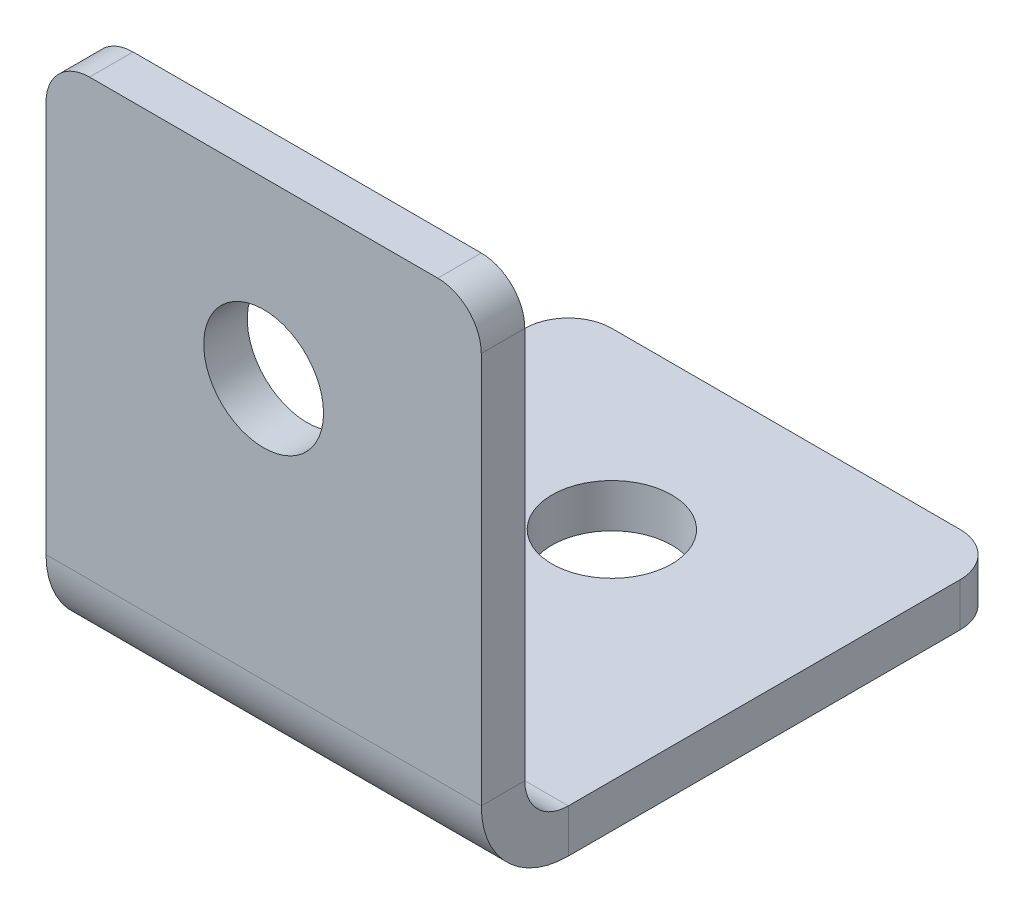
ISO-10303-21;
HEADER;
FILE_DESCRIPTION(('STEP AP214'),'2;1');
FILE_NAME('part.step','',(''),(''),'','','');
FILE_SCHEMA(('AUTOMOTIVE_DESIGN { 1 0 10303 214 1 1 1 1 }'));
ENDSEC;
DATA;
#1=APPLICATION_CONTEXT('core data for automotive mechanical design processes');
#2=APPLICATION_PROTOCOL_DEFINITION('international standard','automotive_design',2000,#1);
#3=PRODUCT_CONTEXT('',#1,'mechanical');
#4=PRODUCT('Part','Part','',(#3));
#5=PRODUCT_RELATED_PRODUCT_CATEGORY('part','',(#4));
#6=PRODUCT_DEFINITION_FORMATION('','',#4);
#7=PRODUCT_DEFINITION_CONTEXT('part definition',#1,'design');
#8=PRODUCT_DEFINITION('design','',#6,#7);
#9=PRODUCT_DEFINITION_SHAPE('','',#8);
#10=(LENGTH_UNIT() NAMED_UNIT(*) SI_UNIT(.MILLI.,.METRE.));
#11=(NAMED_UNIT(*) PLANE_ANGLE_UNIT() SI_UNIT($,.RADIAN.));
#12=(NAMED_UNIT(*) SI_UNIT($,.STERADIAN.) SOLID_ANGLE_UNIT());
#13=UNCERTAINTY_MEASURE_WITH_UNIT(LENGTH_MEASURE(1.E-05),#10,'distance_accuracy_value','');
#14=(GEOMETRIC_REPRESENTATION_CONTEXT(3) GLOBAL_UNCERTAINTY_ASSIGNED_CONTEXT((#13)) GLOBAL_UNIT_ASSIGNED_CONTEXT((#10,
#11,#12)) REPRESENTATION_CONTEXT('',''));
#15=CARTESIAN_POINT('',(0.,0.,0.));
#16=DIRECTION('',(0.,0.,1.));
#17=DIRECTION('',(1.,0.,0.));
#18=AXIS2_PLACEMENT_3D('',#15,#16,#17);
#19=CARTESIAN_POINT('',(31.75,6.35,0.));
#20=DIRECTION('',(1.,0.,0.));
#21=DIRECTION('',(0.,0.,-1.));
#22=AXIS2_PLACEMENT_3D('',#19,#20,#21);
#23=PLANE('',#22);
#24=DIRECTION('',(0.,0.,-1.));
#25=VECTOR('',#24,1.);
#26=CARTESIAN_POINT('',(31.75,6.35,0.));
#27=LINE('',#26,#25);
#28=CARTESIAN_POINT('',(31.75,6.35,0.));
#29=VERTEX_POINT('',#28);
#30=CARTESIAN_POINT('',(31.75,6.35,-3.175));
#31=VERTEX_POINT('',#30);
#32=EDGE_CURVE('E143',#29,#31,#27,.T.);
#33=ORIENTED_EDGE('',*,*,#32,.F.);
#34=CARTESIAN_POINT('',(31.75,6.35,-6.35));
#35=DIRECTION('',(-1.,0.,0.));
#36=DIRECTION('',(0.,0.,1.));
#37=AXIS2_PLACEMENT_3D('',#34,#35,#36);
#38=CIRCLE('',#37,6.35);
#39=CARTESIAN_POINT('',(31.75,0.,-6.35));
#40=VERTEX_POINT('',#39);
#41=EDGE_CURVE('E137',#29,#40,#38,.F.);
#42=ORIENTED_EDGE('',*,*,#41,.T.);
#43=DIRECTION('',(0.,-1.,0.));
#44=VECTOR('',#43,1.);
#45=CARTESIAN_POINT('',(31.75,3.175,-6.35));
#46=LINE('',#45,#44);
#47=CARTESIAN_POINT('',(31.75,3.175,-6.35));
#48=VERTEX_POINT('',#47);
#49=EDGE_CURVE('E131',#48,#40,#46,.T.);
#50=ORIENTED_EDGE('',*,*,#49,.F.);
#51=CARTESIAN_POINT('',(31.75,6.35,-6.35));
#52=DIRECTION('',(1.,0.,0.));
#53=DIRECTION('',(0.,0.,-1.));
#54=AXIS2_PLACEMENT_3D('',#51,#52,#53);
#55=CIRCLE('',#54,3.175);
#56=EDGE_CURVE('E135',#31,#48,#55,.T.);
#57=ORIENTED_EDGE('',*,*,#56,.F.);
#58=EDGE_LOOP('',(#33,#42,#50,#57));
#59=FACE_BOUND('',#58,.T.);
#60=ADVANCED_FACE('F40',(#59),#23,.T.);
#61=CARTESIAN_POINT('',(31.75,3.175,-6.35));
#62=DIRECTION('',(1.,0.,0.));
#63=DIRECTION('',(0.,0.,-1.));
#64=AXIS2_PLACEMENT_3D('',#61,#62,#63);
#65=PLANE('',#64);
#66=DIRECTION('',(0.,1.,0.));
#67=VECTOR('',#66,1.);
#68=CARTESIAN_POINT('',(31.75,0.,-3.175));
#69=LINE('',#68,#67);
#70=CARTESIAN_POINT('',(31.75,34.925,-3.175));
#71=VERTEX_POINT('',#70);
#72=EDGE_CURVE('E173',#71,#31,#69,.F.);
#73=ORIENTED_EDGE('',*,*,#72,.F.);
#74=DIRECTION('',(0.,0.,-1.));
#75=VECTOR('',#74,1.);
#76=CARTESIAN_POINT('',(31.75,34.925,-6.35));
#77=LINE('',#76,#75);
#78=CARTESIAN_POINT('',(31.75,34.925,0.));
#79=VERTEX_POINT('',#78);
#80=EDGE_CURVE('E49',#71,#79,#77,.F.);
#81=ORIENTED_EDGE('',*,*,#80,.T.);
#82=DIRECTION('',(0.,-1.,0.));
#83=VECTOR('',#82,1.);
#84=CARTESIAN_POINT('',(31.75,0.,0.));
#85=LINE('',#84,#83);
#86=EDGE_CURVE('E177',#79,#29,#85,.T.);
#87=ORIENTED_EDGE('',*,*,#86,.T.);
#88=ORIENTED_EDGE('',*,*,#32,.T.);
#89=EDGE_LOOP('',(#73,#81,#87,#88));
#90=FACE_BOUND('',#89,.T.);
#91=ADVANCED_FACE('F338',(#90),#65,.T.);
#92=CARTESIAN_POINT('',(0.,0.,-6.35));
#93=DIRECTION('',(-1.,0.,0.));
#94=DIRECTION('',(0.,0.,1.));
#95=AXIS2_PLACEMENT_3D('',#92,#93,#94);
#96=PLANE('',#95);
#97=DIRECTION('',(0.,1.,0.));
#98=VECTOR('',#97,1.);
#99=CARTESIAN_POINT('',(0.,0.,-6.35));
#100=LINE('',#99,#98);
#101=CARTESIAN_POINT('',(0.,0.,-6.35));
#102=VERTEX_POINT('',#101);
#103=CARTESIAN_POINT('',(0.,3.175,-6.35));
#104=VERTEX_POINT('',#103);
#105=EDGE_CURVE('E144',#102,#104,#100,.T.);
#106=ORIENTED_EDGE('',*,*,#105,.F.);
#107=CARTESIAN_POINT('',(0.,6.35,-6.35));
#108=DIRECTION('',(-1.,0.,0.));
#109=DIRECTION('',(0.,0.,1.));
#110=AXIS2_PLACEMENT_3D('',#107,#108,#109);
#111=CIRCLE('',#110,6.35);
#112=CARTESIAN_POINT('',(0.,6.35,0.));
#113=VERTEX_POINT('',#112);
#114=EDGE_CURVE('E202',#113,#102,#111,.F.);
#115=ORIENTED_EDGE('',*,*,#114,.F.);
#116=DIRECTION('',(0.,0.,1.));
#117=VECTOR('',#116,1.);
#118=CARTESIAN_POINT('',(0.,6.35,-3.175));
#119=LINE('',#118,#117);
#120=CARTESIAN_POINT('',(0.,6.35,-3.175));
#121=VERTEX_POINT('',#120);
#122=EDGE_CURVE('E227',#121,#113,#119,.T.);
#123=ORIENTED_EDGE('',*,*,#122,.F.);
#124=CARTESIAN_POINT('',(0.,6.35,-6.35));
#125=DIRECTION('',(1.,0.,0.));
#126=DIRECTION('',(0.,0.,-1.));
#127=AXIS2_PLACEMENT_3D('',#124,#125,#126);
#128=CIRCLE('',#127,3.175);
#129=EDGE_CURVE('E193',#121,#104,#128,.T.);
#130=ORIENTED_EDGE('',*,*,#129,.T.);
#131=EDGE_LOOP('',(#106,#115,#123,#130));
#132=FACE_BOUND('',#131,.T.);
#133=ADVANCED_FACE('F374',(#132),#96,.T.);
#134=CARTESIAN_POINT('',(0.,6.35,-3.175));
#135=DIRECTION('',(-1.,0.,0.));
#136=DIRECTION('',(0.,0.,1.));
#137=AXIS2_PLACEMENT_3D('',#134,#135,#136);
#138=PLANE('',#137);
#139=DIRECTION('',(0.,0.,-1.));
#140=VECTOR('',#139,1.);
#141=CARTESIAN_POINT('',(0.,3.175,0.));
#142=LINE('',#141,#140);
#143=CARTESIAN_POINT('',(0.,3.175,-34.925));
#144=VERTEX_POINT('',#143);
#145=EDGE_CURVE('E156',#104,#144,#142,.T.);
#146=ORIENTED_EDGE('',*,*,#145,.T.);
#147=DIRECTION('',(0.,-1.,0.));
#148=VECTOR('',#147,1.);
#149=CARTESIAN_POINT('',(0.,6.35,-34.925));
#150=LINE('',#149,#148);
#151=CARTESIAN_POINT('',(0.,0.,-34.925));
#152=VERTEX_POINT('',#151);
#153=EDGE_CURVE('E236',#144,#152,#150,.T.);
#154=ORIENTED_EDGE('',*,*,#153,.T.);
#155=DIRECTION('',(0.,0.,-1.));
#156=VECTOR('',#155,1.);
#157=CARTESIAN_POINT('',(0.,0.,0.));
#158=LINE('',#157,#156);
#159=EDGE_CURVE('E186',#102,#152,#158,.T.);
#160=ORIENTED_EDGE('',*,*,#159,.F.);
#161=ORIENTED_EDGE('',*,*,#105,.T.);
#162=EDGE_LOOP('',(#146,#154,#160,#161));
#163=FACE_BOUND('',#162,.T.);
#164=ADVANCED_FACE('F365',(#163),#138,.T.);
#165=CARTESIAN_POINT('',(31.75,0.,0.));
#166=DIRECTION('',(0.,1.,0.));
#167=DIRECTION('',(0.,0.,1.));
#168=AXIS2_PLACEMENT_3D('',#165,#166,#167);
#169=PLANE('',#168);
#170=CARTESIAN_POINT('',(15.875,0.,-25.4));
#171=DIRECTION('',(0.,-1.,0.));
#172=DIRECTION('',(0.,0.,-1.));
#173=AXIS2_PLACEMENT_3D('',#170,#171,#172);
#174=CIRCLE('',#173,4.3688);
#175=CARTESIAN_POINT('',(15.875,0.,-29.7688));
#176=VERTEX_POINT('',#175);
#177=EDGE_CURVE('E242',#176,#176,#174,.T.);
#178=ORIENTED_EDGE('',*,*,#177,.F.);
#179=EDGE_LOOP('',(#178));
#180=FACE_BOUND('',#179,.T.);
#181=ORIENTED_EDGE('',*,*,#159,.T.);
#182=CARTESIAN_POINT('',(3.175,0.,-34.925));
#183=DIRECTION('',(0.,1.,0.));
#184=DIRECTION('',(0.,0.,1.));
#185=AXIS2_PLACEMENT_3D('',#182,#183,#184);
#186=CIRCLE('',#185,3.175);
#187=CARTESIAN_POINT('',(3.175,0.,-38.1));
#188=VERTEX_POINT('',#187);
#189=EDGE_CURVE('E249',#152,#188,#186,.F.);
#190=ORIENTED_EDGE('',*,*,#189,.T.);
#191=DIRECTION('',(-1.,0.,0.));
#192=VECTOR('',#191,1.);
#193=CARTESIAN_POINT('',(31.75,0.,-38.1));
#194=LINE('',#193,#192);
#195=CARTESIAN_POINT('',(28.575,0.,-38.1));
#196=VERTEX_POINT('',#195);
#197=EDGE_CURVE('E223',#196,#188,#194,.T.);
#198=ORIENTED_EDGE('',*,*,#197,.F.);
#199=CARTESIAN_POINT('',(28.575,0.,-34.925));
#200=DIRECTION('',(0.,1.,0.));
#201=DIRECTION('',(0.,0.,1.));
#202=AXIS2_PLACEMENT_3D('',#199,#200,#201);
#203=CIRCLE('',#202,3.175);
#204=CARTESIAN_POINT('',(31.75,0.,-34.925));
#205=VERTEX_POINT('',#204);
#206=EDGE_CURVE('E246',#196,#205,#203,.F.);
#207=ORIENTED_EDGE('',*,*,#206,.T.);
#208=DIRECTION('',(0.,0.,-1.));
#209=VECTOR('',#208,1.);
#210=CARTESIAN_POINT('',(31.75,0.,0.));
#211=LINE('',#210,#209);
#212=EDGE_CURVE('E167',#40,#205,#211,.T.);
#213=ORIENTED_EDGE('',*,*,#212,.F.);
#214=DIRECTION('',(-1.,0.,0.));
#215=VECTOR('',#214,1.);
#216=CARTESIAN_POINT('',(31.75,0.,-6.35));
#217=LINE('',#216,#215);
#218=EDGE_CURVE('E185',#40,#102,#217,.T.);
#219=ORIENTED_EDGE('',*,*,#218,.T.);
#220=EDGE_LOOP('',(#181,#190,#198,#207,#213,#219));
#221=FACE_BOUND('',#220,.T.);
#222=ADVANCED_FACE('F345',(#180,#221),#169,.F.);
#223=CARTESIAN_POINT('',(31.75,3.175,-38.1));
#224=DIRECTION('',(0.,0.,-1.));
#225=DIRECTION('',(-1.,0.,0.));
#226=AXIS2_PLACEMENT_3D('',#223,#224,#225);
#227=PLANE('',#226);
#228=ORIENTED_EDGE('',*,*,#197,.T.);
#229=DIRECTION('',(0.,-1.,0.));
#230=VECTOR('',#229,1.);
#231=CARTESIAN_POINT('',(3.175,3.175,-38.1));
#232=LINE('',#231,#230);
#233=CARTESIAN_POINT('',(3.175,3.175,-38.1));
#234=VERTEX_POINT('',#233);
#235=EDGE_CURVE('E256',#188,#234,#232,.F.);
#236=ORIENTED_EDGE('',*,*,#235,.T.);
#237=DIRECTION('',(-1.,0.,0.));
#238=VECTOR('',#237,1.);
#239=CARTESIAN_POINT('',(31.75,3.175,-38.1));
#240=LINE('',#239,#238);
#241=CARTESIAN_POINT('',(28.575,3.175,-38.1));
#242=VERTEX_POINT('',#241);
#243=EDGE_CURVE('E161',#242,#234,#240,.T.);
#244=ORIENTED_EDGE('',*,*,#243,.F.);
#245=DIRECTION('',(0.,-1.,0.));
#246=VECTOR('',#245,1.);
#247=CARTESIAN_POINT('',(28.575,3.175,-38.1));
#248=LINE('',#247,#246);
#249=EDGE_CURVE('E252',#242,#196,#248,.T.);
#250=ORIENTED_EDGE('',*,*,#249,.T.);
#251=EDGE_LOOP('',(#228,#236,#244,#250));
#252=FACE_BOUND('',#251,.T.);
#253=ADVANCED_FACE('F364',(#252),#227,.T.);
#254=CARTESIAN_POINT('',(31.75,3.175,0.));
#255=DIRECTION('',(0.,1.,0.));
#256=DIRECTION('',(0.,0.,1.));
#257=AXIS2_PLACEMENT_3D('',#254,#255,#256);
#258=PLANE('',#257);
#259=CARTESIAN_POINT('',(15.875,3.175,-25.4));
#260=DIRECTION('',(0.,1.,0.));
#261=DIRECTION('',(0.,0.,1.));
#262=AXIS2_PLACEMENT_3D('',#259,#260,#261);
#263=CIRCLE('',#262,4.3688);
#264=CARTESIAN_POINT('',(15.875,3.175,-29.7688));
#265=VERTEX_POINT('',#264);
#266=EDGE_CURVE('E237',#265,#265,#263,.T.);
#267=ORIENTED_EDGE('',*,*,#266,.F.);
#268=EDGE_LOOP('',(#267));
#269=FACE_BOUND('',#268,.T.);
#270=ORIENTED_EDGE('',*,*,#243,.T.);
#271=CARTESIAN_POINT('',(3.175,3.175,-34.925));
#272=DIRECTION('',(0.,1.,0.));
#273=DIRECTION('',(0.,0.,1.));
#274=AXIS2_PLACEMENT_3D('',#271,#272,#273);
#275=CIRCLE('',#274,3.175);
#276=EDGE_CURVE('E262',#234,#144,#275,.T.);
#277=ORIENTED_EDGE('',*,*,#276,.T.);
#278=ORIENTED_EDGE('',*,*,#145,.F.);
#279=DIRECTION('',(-1.,0.,0.));
#280=VECTOR('',#279,1.);
#281=CARTESIAN_POINT('',(31.75,3.175,-6.35));
#282=LINE('',#281,#280);
#283=EDGE_CURVE('E150',#48,#104,#282,.T.);
#284=ORIENTED_EDGE('',*,*,#283,.F.);
#285=DIRECTION('',(0.,0.,-1.));
#286=VECTOR('',#285,1.);
#287=CARTESIAN_POINT('',(31.75,3.175,0.));
#288=LINE('',#287,#286);
#289=CARTESIAN_POINT('',(31.75,3.175,-34.925));
#290=VERTEX_POINT('',#289);
#291=EDGE_CURVE('E153',#48,#290,#288,.T.);
#292=ORIENTED_EDGE('',*,*,#291,.T.);
#293=CARTESIAN_POINT('',(28.575,3.175,-34.925));
#294=DIRECTION('',(0.,1.,0.));
#295=DIRECTION('',(0.,0.,1.));
#296=AXIS2_PLACEMENT_3D('',#293,#294,#295);
#297=CIRCLE('',#296,3.175);
#298=EDGE_CURVE('E259',#290,#242,#297,.T.);
#299=ORIENTED_EDGE('',*,*,#298,.T.);
#300=EDGE_LOOP('',(#270,#277,#278,#284,#292,#299));
#301=FACE_BOUND('',#300,.T.);
#302=ADVANCED_FACE('F152',(#269,#301),#258,.T.);
#303=CARTESIAN_POINT('',(31.75,6.35,-6.35));
#304=DIRECTION('',(-1.,0.,0.));
#305=DIRECTION('',(0.,0.,1.));
#306=AXIS2_PLACEMENT_3D('',#303,#304,#305);
#307=CYLINDRICAL_SURFACE('',#306,3.175);
#308=ORIENTED_EDGE('',*,*,#129,.F.);
#309=DIRECTION('',(-1.,0.,0.));
#310=VECTOR('',#309,1.);
#311=CARTESIAN_POINT('',(31.75,6.35,-3.175));
#312=LINE('',#311,#310);
#313=EDGE_CURVE('E162',#31,#121,#312,.T.);
#314=ORIENTED_EDGE('',*,*,#313,.F.);
#315=ORIENTED_EDGE('',*,*,#56,.T.);
#316=ORIENTED_EDGE('',*,*,#283,.T.);
#317=EDGE_LOOP('',(#308,#314,#315,#316));
#318=FACE_BOUND('',#317,.T.);
#319=ADVANCED_FACE('F170',(#318),#307,.F.);
#320=CARTESIAN_POINT('',(31.75,0.,-3.175));
#321=DIRECTION('',(0.,0.,-1.));
#322=DIRECTION('',(-1.,0.,0.));
#323=AXIS2_PLACEMENT_3D('',#320,#321,#322);
#324=PLANE('',#323);
#325=CARTESIAN_POINT('',(15.875,25.4,-3.175));
#326=DIRECTION('',(0.,0.,-1.));
#327=DIRECTION('',(-1.,0.,0.));
#328=AXIS2_PLACEMENT_3D('',#325,#326,#327);
#329=CIRCLE('',#328,4.3688);
#330=CARTESIAN_POINT('',(20.2438,25.4,-3.175));
#331=VERTEX_POINT('',#330);
#332=EDGE_CURVE('E190',#331,#331,#329,.T.);
#333=ORIENTED_EDGE('',*,*,#332,.F.);
#334=EDGE_LOOP('',(#333));
#335=FACE_BOUND('',#334,.T.);
#336=DIRECTION('',(0.,1.,0.));
#337=VECTOR('',#336,1.);
#338=CARTESIAN_POINT('',(0.,0.,-3.175));
#339=LINE('',#338,#337);
#340=CARTESIAN_POINT('',(0.,34.925,-3.175));
#341=VERTEX_POINT('',#340);
#342=EDGE_CURVE('E196',#341,#121,#339,.F.);
#343=ORIENTED_EDGE('',*,*,#342,.F.);
#344=CARTESIAN_POINT('',(3.175,34.925,-3.175));
#345=DIRECTION('',(0.,0.,-1.));
#346=DIRECTION('',(-1.,0.,0.));
#347=AXIS2_PLACEMENT_3D('',#344,#345,#346);
#348=CIRCLE('',#347,3.175);
#349=CARTESIAN_POINT('',(3.175,38.1,-3.175));
#350=VERTEX_POINT('',#349);
#351=EDGE_CURVE('E272',#341,#350,#348,.T.);
#352=ORIENTED_EDGE('',*,*,#351,.T.);
#353=DIRECTION('',(-1.,0.,0.));
#354=VECTOR('',#353,1.);
#355=CARTESIAN_POINT('',(31.75,38.1,-3.175));
#356=LINE('',#355,#354);
#357=CARTESIAN_POINT('',(28.575,38.1,-3.175));
#358=VERTEX_POINT('',#357);
#359=EDGE_CURVE('E216',#358,#350,#356,.T.);
#360=ORIENTED_EDGE('',*,*,#359,.F.);
#361=CARTESIAN_POINT('',(28.575,34.925,-3.175));
#362=DIRECTION('',(0.,0.,-1.));
#363=DIRECTION('',(-1.,0.,0.));
#364=AXIS2_PLACEMENT_3D('',#361,#362,#363);
#365=CIRCLE('',#364,3.175);
#366=EDGE_CURVE('E269',#358,#71,#365,.T.);
#367=ORIENTED_EDGE('',*,*,#366,.T.);
#368=ORIENTED_EDGE('',*,*,#72,.T.);
#369=ORIENTED_EDGE('',*,*,#313,.T.);
#370=EDGE_LOOP('',(#343,#352,#360,#367,#368,#369));
#371=FACE_BOUND('',#370,.T.);
#372=ADVANCED_FACE('F332',(#335,#371),#324,.T.);
#373=CARTESIAN_POINT('',(31.75,38.1,0.));
#374=DIRECTION('',(0.,1.,0.));
#375=DIRECTION('',(0.,0.,1.));
#376=AXIS2_PLACEMENT_3D('',#373,#374,#375);
#377=PLANE('',#376);
#378=ORIENTED_EDGE('',*,*,#359,.T.);
#379=DIRECTION('',(0.,0.,-1.));
#380=VECTOR('',#379,1.);
#381=CARTESIAN_POINT('',(3.175,38.1,0.));
#382=LINE('',#381,#380);
#383=CARTESIAN_POINT('',(3.175,38.1,0.));
#384=VERTEX_POINT('',#383);
#385=EDGE_CURVE('E63',#350,#384,#382,.F.);
#386=ORIENTED_EDGE('',*,*,#385,.T.);
#387=DIRECTION('',(-1.,0.,0.));
#388=VECTOR('',#387,1.);
#389=CARTESIAN_POINT('',(31.75,38.1,0.));
#390=LINE('',#389,#388);
#391=CARTESIAN_POINT('',(28.575,38.1,0.));
#392=VERTEX_POINT('',#391);
#393=EDGE_CURVE('E213',#392,#384,#390,.T.);
#394=ORIENTED_EDGE('',*,*,#393,.F.);
#395=DIRECTION('',(0.,0.,-1.));
#396=VECTOR('',#395,1.);
#397=CARTESIAN_POINT('',(28.575,38.1,0.));
#398=LINE('',#397,#396);
#399=EDGE_CURVE('E275',#392,#358,#398,.T.);
#400=ORIENTED_EDGE('',*,*,#399,.T.);
#401=EDGE_LOOP('',(#378,#386,#394,#400));
#402=FACE_BOUND('',#401,.T.);
#403=ADVANCED_FACE('F333',(#402),#377,.T.);
#404=CARTESIAN_POINT('',(31.75,0.,0.));
#405=DIRECTION('',(0.,0.,-1.));
#406=DIRECTION('',(-1.,0.,0.));
#407=AXIS2_PLACEMENT_3D('',#404,#405,#406);
#408=PLANE('',#407);
#409=CARTESIAN_POINT('',(15.875,25.4,0.));
#410=DIRECTION('',(0.,0.,1.));
#411=DIRECTION('',(1.,0.,0.));
#412=AXIS2_PLACEMENT_3D('',#409,#410,#411);
#413=CIRCLE('',#412,4.3688);
#414=CARTESIAN_POINT('',(20.2438,25.4,0.));
#415=VERTEX_POINT('',#414);
#416=EDGE_CURVE('E241',#415,#415,#413,.T.);
#417=ORIENTED_EDGE('',*,*,#416,.F.);
#418=EDGE_LOOP('',(#417));
#419=FACE_BOUND('',#418,.T.);
#420=ORIENTED_EDGE('',*,*,#393,.T.);
#421=CARTESIAN_POINT('',(3.175,34.925,0.));
#422=DIRECTION('',(0.,0.,-1.));
#423=DIRECTION('',(-1.,0.,0.));
#424=AXIS2_PLACEMENT_3D('',#421,#422,#423);
#425=CIRCLE('',#424,3.175);
#426=CARTESIAN_POINT('',(0.,34.925,0.));
#427=VERTEX_POINT('',#426);
#428=EDGE_CURVE('E284',#384,#427,#425,.F.);
#429=ORIENTED_EDGE('',*,*,#428,.T.);
#430=DIRECTION('',(0.,-1.,0.));
#431=VECTOR('',#430,1.);
#432=CARTESIAN_POINT('',(0.,0.,0.));
#433=LINE('',#432,#431);
#434=EDGE_CURVE('E199',#427,#113,#433,.T.);
#435=ORIENTED_EDGE('',*,*,#434,.T.);
#436=DIRECTION('',(-1.,0.,0.));
#437=VECTOR('',#436,1.);
#438=CARTESIAN_POINT('',(31.75,6.35,0.));
#439=LINE('',#438,#437);
#440=EDGE_CURVE('E209',#29,#113,#439,.T.);
#441=ORIENTED_EDGE('',*,*,#440,.F.);
#442=ORIENTED_EDGE('',*,*,#86,.F.);
#443=CARTESIAN_POINT('',(28.575,34.925,0.));
#444=DIRECTION('',(0.,0.,-1.));
#445=DIRECTION('',(-1.,0.,0.));
#446=AXIS2_PLACEMENT_3D('',#443,#444,#445);
#447=CIRCLE('',#446,3.175);
#448=EDGE_CURVE('E281',#79,#392,#447,.F.);
#449=ORIENTED_EDGE('',*,*,#448,.T.);
#450=EDGE_LOOP('',(#420,#429,#435,#441,#442,#449));
#451=FACE_BOUND('',#450,.T.);
#452=ADVANCED_FACE('F321',(#419,#451),#408,.F.);
#453=CARTESIAN_POINT('',(31.75,6.35,-6.35));
#454=DIRECTION('',(-1.,0.,0.));
#455=DIRECTION('',(0.,0.,1.));
#456=AXIS2_PLACEMENT_3D('',#453,#454,#455);
#457=CYLINDRICAL_SURFACE('',#456,6.35);
#458=ORIENTED_EDGE('',*,*,#114,.T.);
#459=ORIENTED_EDGE('',*,*,#218,.F.);
#460=ORIENTED_EDGE('',*,*,#41,.F.);
#461=ORIENTED_EDGE('',*,*,#440,.T.);
#462=EDGE_LOOP('',(#458,#459,#460,#461));
#463=FACE_BOUND('',#462,.T.);
#464=ADVANCED_FACE('F341',(#463),#457,.T.);
#465=CARTESIAN_POINT('',(31.75,6.35,-6.35));
#466=DIRECTION('',(1.,0.,0.));
#467=DIRECTION('',(0.,0.,-1.));
#468=AXIS2_PLACEMENT_3D('',#465,#466,#467);
#469=PLANE('',#468);
#470=ORIENTED_EDGE('',*,*,#212,.T.);
#471=DIRECTION('',(0.,-1.,0.));
#472=VECTOR('',#471,1.);
#473=CARTESIAN_POINT('',(31.75,6.35,-34.925));
#474=LINE('',#473,#472);
#475=EDGE_CURVE('E11',#205,#290,#474,.F.);
#476=ORIENTED_EDGE('',*,*,#475,.T.);
#477=ORIENTED_EDGE('',*,*,#291,.F.);
#478=ORIENTED_EDGE('',*,*,#49,.T.);
#479=EDGE_LOOP('',(#470,#476,#477,#478));
#480=FACE_BOUND('',#479,.T.);
#481=ADVANCED_FACE('F164',(#480),#469,.T.);
#482=CARTESIAN_POINT('',(0.,6.35,-6.35));
#483=DIRECTION('',(1.,0.,0.));
#484=DIRECTION('',(0.,0.,-1.));
#485=AXIS2_PLACEMENT_3D('',#482,#483,#484);
#486=PLANE('',#485);
#487=ORIENTED_EDGE('',*,*,#434,.F.);
#488=DIRECTION('',(0.,0.,-1.));
#489=VECTOR('',#488,1.);
#490=CARTESIAN_POINT('',(0.,34.925,-3.175));
#491=LINE('',#490,#489);
#492=EDGE_CURVE('E265',#427,#341,#491,.T.);
#493=ORIENTED_EDGE('',*,*,#492,.T.);
#494=ORIENTED_EDGE('',*,*,#342,.T.);
#495=ORIENTED_EDGE('',*,*,#122,.T.);
#496=EDGE_LOOP('',(#487,#493,#494,#495));
#497=FACE_BOUND('',#496,.T.);
#498=ADVANCED_FACE('F326',(#497),#486,.F.);
#499=CARTESIAN_POINT('',(15.875,25.4,-38.1));
#500=DIRECTION('',(0.,0.,1.));
#501=DIRECTION('',(1.,0.,0.));
#502=AXIS2_PLACEMENT_3D('',#499,#500,#501);
#503=CYLINDRICAL_SURFACE('',#502,4.3688);
#504=CARTESIAN_POINT('',(20.2438,25.4,-3.175));
#505=CARTESIAN_POINT('',(20.2438,25.4,-3.14192708333333));
#506=CARTESIAN_POINT('',(20.2438,25.4,-3.10885416666667));
#507=CARTESIAN_POINT('',(20.2438,25.4,-3.04270833333333));
#508=CARTESIAN_POINT('',(20.2438,25.4,-3.00963541666666));
#509=CARTESIAN_POINT('',(20.2438,25.4,-2.94348958333333));
#510=CARTESIAN_POINT('',(20.2438,25.4,-2.91041666666666));
#511=CARTESIAN_POINT('',(20.2438,25.4,-2.84427083333333));
#512=CARTESIAN_POINT('',(20.2438,25.4,-2.81119791666667));
#513=CARTESIAN_POINT('',(20.2438,25.4,-2.74505208333333));
#514=CARTESIAN_POINT('',(20.2438,25.4,-2.71197916666666));
#515=CARTESIAN_POINT('',(20.2438,25.4,-2.64583333333333));
#516=CARTESIAN_POINT('',(20.2438,25.4,-2.61276041666666));
#517=CARTESIAN_POINT('',(20.2438,25.4,-2.54661458333333));
#518=CARTESIAN_POINT('',(20.2438,25.4,-2.51354166666667));
#519=CARTESIAN_POINT('',(20.2438,25.4,-2.44739583333333));
#520=CARTESIAN_POINT('',(20.2438,25.4,-2.41432291666667));
#521=CARTESIAN_POINT('',(20.2438,25.4,-2.34817708333333));
#522=CARTESIAN_POINT('',(20.2438,25.4,-2.31510416666667));
#523=CARTESIAN_POINT('',(20.2438,25.4,-2.24895833333333));
#524=CARTESIAN_POINT('',(20.2438,25.4,-2.21588541666666));
#525=CARTESIAN_POINT('',(20.2438,25.4,-2.14973958333333));
#526=CARTESIAN_POINT('',(20.2438,25.4,-2.11666666666667));
#527=CARTESIAN_POINT('',(20.2438,25.4,-2.05052083333333));
#528=CARTESIAN_POINT('',(20.2438,25.4,-2.01744791666667));
#529=CARTESIAN_POINT('',(20.2438,25.4,-1.95130208333333));
#530=CARTESIAN_POINT('',(20.2438,25.4,-1.91822916666666));
#531=CARTESIAN_POINT('',(20.2438,25.4,-1.85208333333333));
#532=CARTESIAN_POINT('',(20.2438,25.4,-1.81901041666667));
#533=CARTESIAN_POINT('',(20.2438,25.4,-1.75286458333333));
#534=CARTESIAN_POINT('',(20.2438,25.4,-1.71979166666666));
#535=CARTESIAN_POINT('',(20.2438,25.4,-1.65364583333333));
#536=CARTESIAN_POINT('',(20.2438,25.4,-1.62057291666666));
#537=CARTESIAN_POINT('',(20.2438,25.4,-1.55442708333333));
#538=CARTESIAN_POINT('',(20.2438,25.4,-1.52135416666667));
#539=CARTESIAN_POINT('',(20.2438,25.4,-1.45520833333333));
#540=CARTESIAN_POINT('',(20.2438,25.4,-1.42213541666666));
#541=CARTESIAN_POINT('',(20.2438,25.4,-1.35598958333333));
#542=CARTESIAN_POINT('',(20.2438,25.4,-1.32291666666666));
#543=CARTESIAN_POINT('',(20.2438,25.4,-1.25677083333333));
#544=CARTESIAN_POINT('',(20.2438,25.4,-1.22369791666667));
#545=CARTESIAN_POINT('',(20.2438,25.4,-1.15755208333333));
#546=CARTESIAN_POINT('',(20.2438,25.4,-1.12447916666666));
#547=CARTESIAN_POINT('',(20.2438,25.4,-1.05833333333333));
#548=CARTESIAN_POINT('',(20.2438,25.4,-1.02526041666666));
#549=CARTESIAN_POINT('',(20.2438,25.4,-0.959114583333332));
#550=CARTESIAN_POINT('',(20.2438,25.4,-0.926041666666666));
#551=CARTESIAN_POINT('',(20.2438,25.4,-0.859895833333332));
#552=CARTESIAN_POINT('',(20.2438,25.4,-0.826822916666664));
#553=CARTESIAN_POINT('',(20.2438,25.4,-0.76067708333333));
#554=CARTESIAN_POINT('',(20.2438,25.4,-0.727604166666664));
#555=CARTESIAN_POINT('',(20.2438,25.4,-0.661458333333332));
#556=CARTESIAN_POINT('',(20.2438,25.4,-0.628385416666666));
#557=CARTESIAN_POINT('',(20.2438,25.4,-0.562239583333334));
#558=CARTESIAN_POINT('',(20.2438,25.4,-0.529166666666669));
#559=CARTESIAN_POINT('',(20.2438,25.4,-0.463020833333334));
#560=CARTESIAN_POINT('',(20.2438,25.4,-0.429947916666666));
#561=CARTESIAN_POINT('',(20.2438,25.4,-0.363802083333332));
#562=CARTESIAN_POINT('',(20.2438,25.4,-0.330729166666666));
#563=CARTESIAN_POINT('',(20.2438,25.4,-0.264583333333334));
#564=CARTESIAN_POINT('',(20.2438,25.4,-0.231510416666668));
#565=CARTESIAN_POINT('',(20.2438,25.4,-0.165364583333334));
#566=CARTESIAN_POINT('',(20.2438,25.4,-0.132291666666666));
#567=CARTESIAN_POINT('',(20.2438,25.4,-0.0661458333333318));
#568=CARTESIAN_POINT('',(20.2438,25.4,-0.0330729166666659));
#569=CARTESIAN_POINT('',(20.2438,25.4,0.));
#570=B_SPLINE_CURVE_WITH_KNOTS('',3,(#504,#505,#506,#507,#508,#509,#510,#511,#512,#513,#514,
#515,#516,#517,#518,#519,#520,#521,#522,#523,#524,#525,#526,#527,#528,#529,#530,#531,#532,#533,
#534,#535,#536,#537,#538,#539,#540,#541,#542,#543,#544,#545,#546,#547,#548,#549,#550,#551,#552,
#553,#554,#555,#556,#557,#558,#559,#560,#561,#562,#563,#564,#565,#566,#567,#568,#569),
.UNSPECIFIED.,.F.,.F.,(4,2,2,2,2,2,2,2,2,2,2,2,2,2,2,2,2,2,2,2,2,2,2,2,2,2,2,2,2,2,2,2,4),(0.,
0.0992187499999977,0.198437500000002,0.29765625,0.396874999999998,0.496093750000003,0.5953125,
0.694531249999998,0.793749999999996,0.892968750000001,0.992187499999998,1.09140625,1.190625,
1.28984375,1.3890625,1.48828125,1.5875,1.68671875,1.7859375,1.88515625,1.984375,2.08359375,
2.1828125,2.28203125,2.38125,2.48046875,2.5796875,2.67890624999999,2.778125,2.87734375,
2.97656249999999,3.07578125,3.175),.UNSPECIFIED.);
#571=EDGE_CURVE('BSEAM495',#331,#415,#570,.T.);
#572=ORIENTED_EDGE('',*,*,#332,.T.);
#573=ORIENTED_EDGE('',*,*,#416,.T.);
#574=ORIENTED_EDGE('',*,*,#571,.T.);
#575=ORIENTED_EDGE('',*,*,#571,.F.);
#576=EDGE_LOOP('',(#572,#574,#573,#575));
#577=FACE_BOUND('',#576,.T.);
#578=ADVANCED_FACE('F495',(#577),#503,.F.);
#579=CARTESIAN_POINT('',(15.875,38.1,-25.4));
#580=DIRECTION('',(0.,-1.,0.));
#581=DIRECTION('',(0.,0.,-1.));
#582=AXIS2_PLACEMENT_3D('',#579,#580,#581);
#583=CYLINDRICAL_SURFACE('',#582,4.3688);
#584=CARTESIAN_POINT('',(15.875,3.175,-29.7688));
#585=CARTESIAN_POINT('',(15.875,3.14192708333333,-29.7688));
#586=CARTESIAN_POINT('',(15.875,3.10885416666667,-29.7688));
#587=CARTESIAN_POINT('',(15.875,3.04270833333333,-29.7688));
#588=CARTESIAN_POINT('',(15.875,3.00963541666666,-29.7688));
#589=CARTESIAN_POINT('',(15.875,2.94348958333333,-29.7688));
#590=CARTESIAN_POINT('',(15.875,2.91041666666666,-29.7688));
#591=CARTESIAN_POINT('',(15.875,2.84427083333333,-29.7688));
#592=CARTESIAN_POINT('',(15.875,2.81119791666667,-29.7688));
#593=CARTESIAN_POINT('',(15.875,2.74505208333333,-29.7688));
#594=CARTESIAN_POINT('',(15.875,2.71197916666666,-29.7688));
#595=CARTESIAN_POINT('',(15.875,2.64583333333333,-29.7688));
#596=CARTESIAN_POINT('',(15.875,2.61276041666666,-29.7688));
#597=CARTESIAN_POINT('',(15.875,2.54661458333333,-29.7688));
#598=CARTESIAN_POINT('',(15.875,2.51354166666667,-29.7688));
#599=CARTESIAN_POINT('',(15.875,2.44739583333333,-29.7688));
#600=CARTESIAN_POINT('',(15.875,2.41432291666667,-29.7688));
#601=CARTESIAN_POINT('',(15.875,2.34817708333333,-29.7688));
#602=CARTESIAN_POINT('',(15.875,2.31510416666667,-29.7688));
#603=CARTESIAN_POINT('',(15.875,2.24895833333333,-29.7688));
#604=CARTESIAN_POINT('',(15.875,2.21588541666666,-29.7688));
#605=CARTESIAN_POINT('',(15.875,2.14973958333333,-29.7688));
#606=CARTESIAN_POINT('',(15.875,2.11666666666667,-29.7688));
#607=CARTESIAN_POINT('',(15.875,2.05052083333333,-29.7688));
#608=CARTESIAN_POINT('',(15.875,2.01744791666667,-29.7688));
#609=CARTESIAN_POINT('',(15.875,1.95130208333333,-29.7688));
#610=CARTESIAN_POINT('',(15.875,1.91822916666666,-29.7688));
#611=CARTESIAN_POINT('',(15.875,1.85208333333333,-29.7688));
#612=CARTESIAN_POINT('',(15.875,1.81901041666667,-29.7688));
#613=CARTESIAN_POINT('',(15.875,1.75286458333333,-29.7688));
#614=CARTESIAN_POINT('',(15.875,1.71979166666666,-29.7688));
#615=CARTESIAN_POINT('',(15.875,1.65364583333333,-29.7688));
#616=CARTESIAN_POINT('',(15.875,1.62057291666666,-29.7688));
#617=CARTESIAN_POINT('',(15.875,1.55442708333333,-29.7688));
#618=CARTESIAN_POINT('',(15.875,1.52135416666667,-29.7688));
#619=CARTESIAN_POINT('',(15.875,1.45520833333333,-29.7688));
#620=CARTESIAN_POINT('',(15.875,1.42213541666666,-29.7688));
#621=CARTESIAN_POINT('',(15.875,1.35598958333333,-29.7688));
#622=CARTESIAN_POINT('',(15.875,1.32291666666666,-29.7688));
#623=CARTESIAN_POINT('',(15.875,1.25677083333333,-29.7688));
#624=CARTESIAN_POINT('',(15.875,1.22369791666667,-29.7688));
#625=CARTESIAN_POINT('',(15.875,1.15755208333333,-29.7688));
#626=CARTESIAN_POINT('',(15.875,1.12447916666666,-29.7688));
#627=CARTESIAN_POINT('',(15.875,1.05833333333333,-29.7688));
#628=CARTESIAN_POINT('',(15.875,1.02526041666666,-29.7688));
#629=CARTESIAN_POINT('',(15.875,0.959114583333332,-29.7688));
#630=CARTESIAN_POINT('',(15.875,0.926041666666666,-29.7688));
#631=CARTESIAN_POINT('',(15.875,0.859895833333332,-29.7688));
#632=CARTESIAN_POINT('',(15.875,0.826822916666664,-29.7688));
#633=CARTESIAN_POINT('',(15.875,0.76067708333333,-29.7688));
#634=CARTESIAN_POINT('',(15.875,0.727604166666664,-29.7688));
#635=CARTESIAN_POINT('',(15.875,0.661458333333332,-29.7688));
#636=CARTESIAN_POINT('',(15.875,0.628385416666666,-29.7688));
#637=CARTESIAN_POINT('',(15.875,0.562239583333334,-29.7688));
#638=CARTESIAN_POINT('',(15.875,0.529166666666669,-29.7688));
#639=CARTESIAN_POINT('',(15.875,0.463020833333334,-29.7688));
#640=CARTESIAN_POINT('',(15.875,0.429947916666666,-29.7688));
#641=CARTESIAN_POINT('',(15.875,0.363802083333332,-29.7688));
#642=CARTESIAN_POINT('',(15.875,0.330729166666666,-29.7688));
#643=CARTESIAN_POINT('',(15.875,0.264583333333334,-29.7688));
#644=CARTESIAN_POINT('',(15.875,0.231510416666668,-29.7688));
#645=CARTESIAN_POINT('',(15.875,0.165364583333334,-29.7688));
#646=CARTESIAN_POINT('',(15.875,0.132291666666666,-29.7688));
#647=CARTESIAN_POINT('',(15.875,0.0661458333333318,-29.7688));
#648=CARTESIAN_POINT('',(15.875,0.0330729166666659,-29.7688));
#649=CARTESIAN_POINT('',(15.875,0.,-29.7688));
#650=B_SPLINE_CURVE_WITH_KNOTS('',3,(#584,#585,#586,#587,#588,#589,#590,#591,#592,#593,#594,
#595,#596,#597,#598,#599,#600,#601,#602,#603,#604,#605,#606,#607,#608,#609,#610,#611,#612,#613,
#614,#615,#616,#617,#618,#619,#620,#621,#622,#623,#624,#625,#626,#627,#628,#629,#630,#631,#632,
#633,#634,#635,#636,#637,#638,#639,#640,#641,#642,#643,#644,#645,#646,#647,#648,#649),
.UNSPECIFIED.,.F.,.F.,(4,2,2,2,2,2,2,2,2,2,2,2,2,2,2,2,2,2,2,2,2,2,2,2,2,2,2,2,2,2,2,2,4),(0.,
0.0992187499999977,0.198437500000002,0.29765625,0.396874999999998,0.496093750000003,0.5953125,
0.694531249999998,0.793749999999996,0.892968750000001,0.992187499999998,1.09140625,1.190625,
1.28984375,1.3890625,1.48828125,1.5875,1.68671875,1.7859375,1.88515625,1.984375,2.08359375,
2.1828125,2.28203125,2.38125,2.48046875,2.5796875,2.67890624999999,2.778125,2.87734375,
2.97656249999999,3.07578125,3.175),.UNSPECIFIED.);
#651=EDGE_CURVE('BSEAM361',#265,#176,#650,.T.);
#652=ORIENTED_EDGE('',*,*,#266,.T.);
#653=ORIENTED_EDGE('',*,*,#177,.T.);
#654=ORIENTED_EDGE('',*,*,#651,.T.);
#655=ORIENTED_EDGE('',*,*,#651,.F.);
#656=EDGE_LOOP('',(#652,#654,#653,#655));
#657=FACE_BOUND('',#656,.T.);
#658=ADVANCED_FACE('F361',(#657),#583,.F.);
#659=CARTESIAN_POINT('',(3.175,6.35,-34.925));
#660=DIRECTION('',(0.,-1.,0.));
#661=DIRECTION('',(0.,0.,-1.));
#662=AXIS2_PLACEMENT_3D('',#659,#660,#661);
#663=CYLINDRICAL_SURFACE('',#662,3.175);
#664=ORIENTED_EDGE('',*,*,#276,.F.);
#665=ORIENTED_EDGE('',*,*,#235,.F.);
#666=ORIENTED_EDGE('',*,*,#189,.F.);
#667=ORIENTED_EDGE('',*,*,#153,.F.);
#668=EDGE_LOOP('',(#664,#665,#666,#667));
#669=FACE_BOUND('',#668,.T.);
#670=ADVANCED_FACE('F385',(#669),#663,.T.);
#671=CARTESIAN_POINT('',(3.175,34.925,-6.35));
#672=DIRECTION('',(0.,0.,1.));
#673=DIRECTION('',(1.,0.,0.));
#674=AXIS2_PLACEMENT_3D('',#671,#672,#673);
#675=CYLINDRICAL_SURFACE('',#674,3.175);
#676=ORIENTED_EDGE('',*,*,#428,.F.);
#677=ORIENTED_EDGE('',*,*,#385,.F.);
#678=ORIENTED_EDGE('',*,*,#351,.F.);
#679=ORIENTED_EDGE('',*,*,#492,.F.);
#680=EDGE_LOOP('',(#676,#677,#678,#679));
#681=FACE_BOUND('',#680,.T.);
#682=ADVANCED_FACE('F329',(#681),#675,.T.);
#683=CARTESIAN_POINT('',(28.575,34.925,0.));
#684=DIRECTION('',(0.,0.,-1.));
#685=DIRECTION('',(-1.,0.,0.));
#686=AXIS2_PLACEMENT_3D('',#683,#684,#685);
#687=CYLINDRICAL_SURFACE('',#686,3.175);
#688=ORIENTED_EDGE('',*,*,#448,.F.);
#689=ORIENTED_EDGE('',*,*,#80,.F.);
#690=ORIENTED_EDGE('',*,*,#366,.F.);
#691=ORIENTED_EDGE('',*,*,#399,.F.);
#692=EDGE_LOOP('',(#688,#689,#690,#691));
#693=FACE_BOUND('',#692,.T.);
#694=ADVANCED_FACE('F337',(#693),#687,.T.);
#695=CARTESIAN_POINT('',(28.575,3.175,-34.925));
#696=DIRECTION('',(0.,-1.,0.));
#697=DIRECTION('',(0.,0.,-1.));
#698=AXIS2_PLACEMENT_3D('',#695,#696,#697);
#699=CYLINDRICAL_SURFACE('',#698,3.175);
#700=ORIENTED_EDGE('',*,*,#298,.F.);
#701=ORIENTED_EDGE('',*,*,#475,.F.);
#702=ORIENTED_EDGE('',*,*,#206,.F.);
#703=ORIENTED_EDGE('',*,*,#249,.F.);
#704=EDGE_LOOP('',(#700,#701,#702,#703));
#705=FACE_BOUND('',#704,.T.);
#706=ADVANCED_FACE('F42',(#705),#699,.T.);
#707=CLOSED_SHELL('',(#60,#91,#133,#164,#222,#253,#302,#319,#372,#403,#452,#464,#481,#498,#578,
#658,#670,#682,#694,#706));
#708=MANIFOLD_SOLID_BREP('B2',#707);
#709=ADVANCED_BREP_SHAPE_REPRESENTATION('',(#18,#708),#14);
#710=SHAPE_DEFINITION_REPRESENTATION(#9,#709);
ENDSEC;
END-ISO-10303-21;
